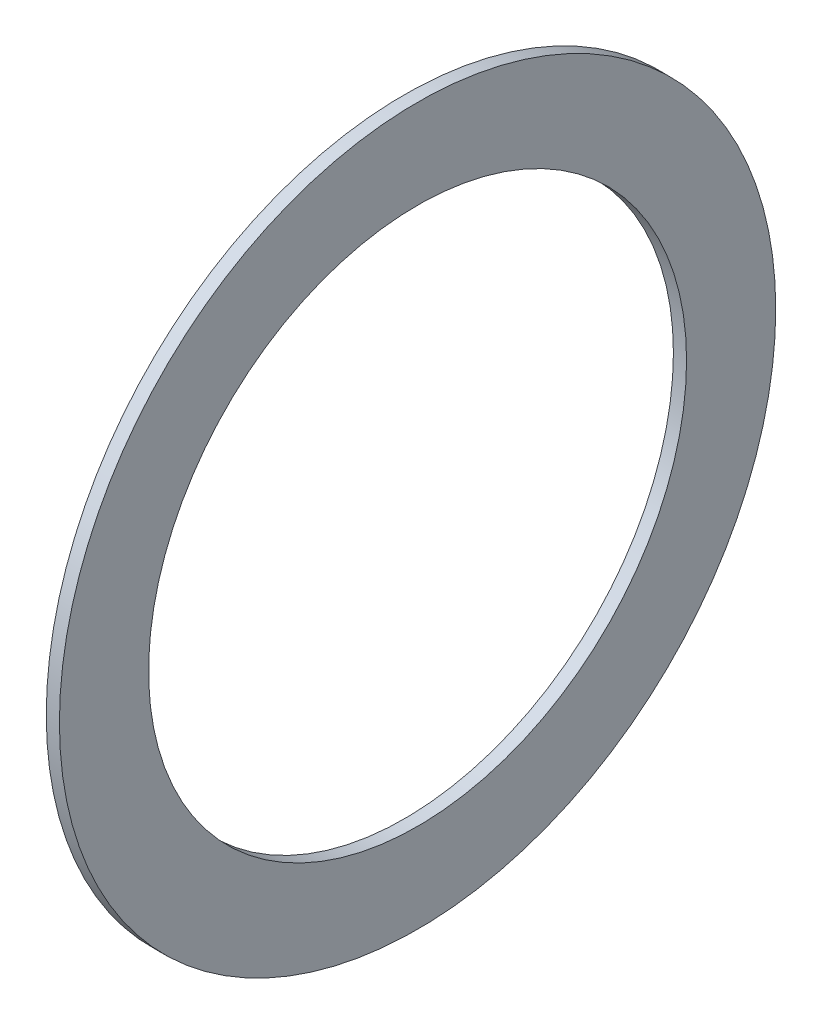
ISO-10303-21;
HEADER;
FILE_DESCRIPTION(('STEP AP214'),'2;1');
FILE_NAME('part.step','',(''),(''),'','','');
FILE_SCHEMA(('AUTOMOTIVE_DESIGN { 1 0 10303 214 1 1 1 1 }'));
ENDSEC;
DATA;
#1=APPLICATION_CONTEXT('core data for automotive mechanical design processes');
#2=APPLICATION_PROTOCOL_DEFINITION('international standard','automotive_design',2000,#1);
#3=PRODUCT_CONTEXT('',#1,'mechanical');
#4=PRODUCT('Part','Part','',(#3));
#5=PRODUCT_RELATED_PRODUCT_CATEGORY('part','',(#4));
#6=PRODUCT_DEFINITION_FORMATION('','',#4);
#7=PRODUCT_DEFINITION_CONTEXT('part definition',#1,'design');
#8=PRODUCT_DEFINITION('design','',#6,#7);
#9=PRODUCT_DEFINITION_SHAPE('','',#8);
#10=(LENGTH_UNIT() NAMED_UNIT(*) SI_UNIT(.MILLI.,.METRE.));
#11=(NAMED_UNIT(*) PLANE_ANGLE_UNIT() SI_UNIT($,.RADIAN.));
#12=(NAMED_UNIT(*) SI_UNIT($,.STERADIAN.) SOLID_ANGLE_UNIT());
#13=UNCERTAINTY_MEASURE_WITH_UNIT(LENGTH_MEASURE(1.E-05),#10,'distance_accuracy_value','');
#14=(GEOMETRIC_REPRESENTATION_CONTEXT(3) GLOBAL_UNCERTAINTY_ASSIGNED_CONTEXT((#13)) GLOBAL_UNIT_ASSIGNED_CONTEXT((#10,
#11,#12)) REPRESENTATION_CONTEXT('',''));
#15=CARTESIAN_POINT('',(0.,0.,0.));
#16=DIRECTION('',(0.,0.,1.));
#17=DIRECTION('',(1.,0.,0.));
#18=AXIS2_PLACEMENT_3D('',#15,#16,#17);
#19=CARTESIAN_POINT('',(1.20000000000001,0.,0.));
#20=DIRECTION('',(1.,0.,0.));
#21=DIRECTION('',(0.,0.,-1.));
#22=AXIS2_PLACEMENT_3D('',#19,#20,#21);
#23=CYLINDRICAL_SURFACE('',#22,24.5);
#24=CARTESIAN_POINT('',(0.299999999999995,0.,0.));
#25=DIRECTION('',(1.,0.,0.));
#26=DIRECTION('',(0.,0.,-1.));
#27=AXIS2_PLACEMENT_3D('',#24,#25,#26);
#28=CIRCLE('',#27,24.5);
#29=CARTESIAN_POINT('',(0.299999999999995,0.,-24.5));
#30=VERTEX_POINT('',#29);
#31=EDGE_CURVE('E30',#30,#30,#28,.T.);
#32=ORIENTED_EDGE('',*,*,#31,.T.);
#33=EDGE_LOOP('',(#32));
#34=FACE_BOUND('',#33,.T.);
#35=CARTESIAN_POINT('',(1.20000000000001,0.,0.));
#36=DIRECTION('',(1.,0.,0.));
#37=DIRECTION('',(0.,0.,-1.));
#38=AXIS2_PLACEMENT_3D('',#35,#36,#37);
#39=CIRCLE('',#38,24.5);
#40=CARTESIAN_POINT('',(1.20000000000001,0.,-24.5));
#41=VERTEX_POINT('',#40);
#42=EDGE_CURVE('E26',#41,#41,#39,.T.);
#43=ORIENTED_EDGE('',*,*,#42,.F.);
#44=EDGE_LOOP('',(#43));
#45=FACE_BOUND('',#44,.T.);
#46=ADVANCED_FACE('F15',(#34,#45),#23,.T.);
#47=CARTESIAN_POINT('',(0.299999999999995,24.5,0.));
#48=DIRECTION('',(-1.,0.,0.));
#49=DIRECTION('',(0.,0.,1.));
#50=AXIS2_PLACEMENT_3D('',#47,#48,#49);
#51=PLANE('',#50);
#52=CARTESIAN_POINT('',(0.299999999999995,0.,0.));
#53=DIRECTION('',(1.,0.,0.));
#54=DIRECTION('',(0.,0.,-1.));
#55=AXIS2_PLACEMENT_3D('',#52,#53,#54);
#56=CIRCLE('',#55,18.4);
#57=CARTESIAN_POINT('',(0.299999999999995,0.,-18.4));
#58=VERTEX_POINT('',#57);
#59=EDGE_CURVE('E22',#58,#58,#56,.T.);
#60=ORIENTED_EDGE('',*,*,#59,.T.);
#61=EDGE_LOOP('',(#60));
#62=FACE_BOUND('',#61,.T.);
#63=ORIENTED_EDGE('',*,*,#31,.F.);
#64=EDGE_LOOP('',(#63));
#65=FACE_BOUND('',#64,.T.);
#66=ADVANCED_FACE('F38',(#62,#65),#51,.T.);
#67=CARTESIAN_POINT('',(1.20000000000001,18.4,0.));
#68=DIRECTION('',(1.,0.,0.));
#69=DIRECTION('',(0.,0.,-1.));
#70=AXIS2_PLACEMENT_3D('',#67,#68,#69);
#71=PLANE('',#70);
#72=ORIENTED_EDGE('',*,*,#42,.T.);
#73=EDGE_LOOP('',(#72));
#74=FACE_BOUND('',#73,.T.);
#75=CARTESIAN_POINT('',(1.20000000000001,0.,0.));
#76=DIRECTION('',(1.,0.,0.));
#77=DIRECTION('',(0.,0.,-1.));
#78=AXIS2_PLACEMENT_3D('',#75,#76,#77);
#79=CIRCLE('',#78,18.4);
#80=CARTESIAN_POINT('',(1.20000000000001,0.,-18.4));
#81=VERTEX_POINT('',#80);
#82=EDGE_CURVE('E10',#81,#81,#79,.T.);
#83=ORIENTED_EDGE('',*,*,#82,.F.);
#84=EDGE_LOOP('',(#83));
#85=FACE_BOUND('',#84,.T.);
#86=ADVANCED_FACE('F40',(#74,#85),#71,.T.);
#87=CARTESIAN_POINT('',(1.20000000000001,0.,0.));
#88=DIRECTION('',(1.,0.,0.));
#89=DIRECTION('',(0.,0.,-1.));
#90=AXIS2_PLACEMENT_3D('',#87,#88,#89);
#91=CYLINDRICAL_SURFACE('',#90,18.4);
#92=ORIENTED_EDGE('',*,*,#82,.T.);
#93=EDGE_LOOP('',(#92));
#94=FACE_BOUND('',#93,.T.);
#95=ORIENTED_EDGE('',*,*,#59,.F.);
#96=EDGE_LOOP('',(#95));
#97=FACE_BOUND('',#96,.T.);
#98=ADVANCED_FACE('F17',(#94,#97),#91,.F.);
#99=CLOSED_SHELL('',(#46,#66,#86,#98));
#100=MANIFOLD_SOLID_BREP('B1',#99);
#101=ADVANCED_BREP_SHAPE_REPRESENTATION('',(#18,#100),#14);
#102=SHAPE_DEFINITION_REPRESENTATION(#9,#101);
ENDSEC;
END-ISO-10303-21;
